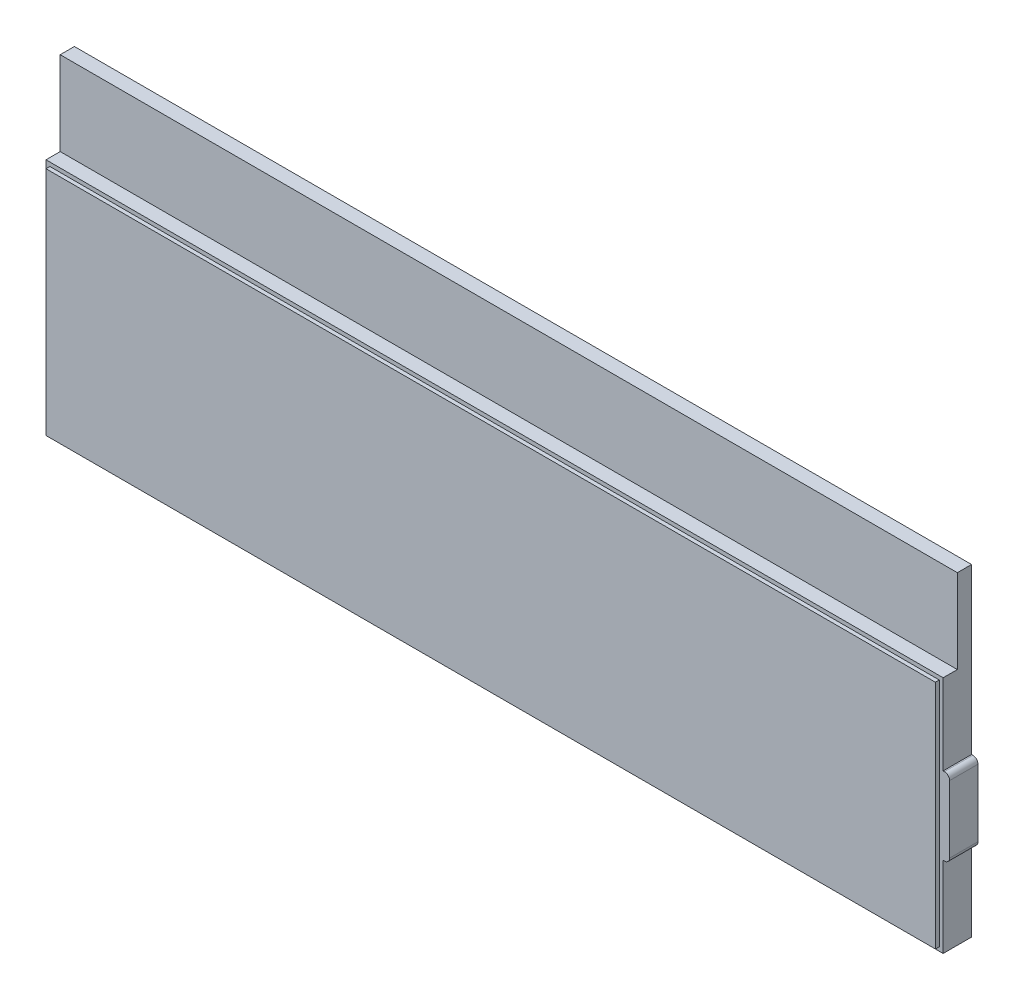
ISO-10303-21;
HEADER;
FILE_DESCRIPTION(('STEP AP214'),'2;1');
FILE_NAME('part.step','',(''),(''),'','','');
FILE_SCHEMA(('AUTOMOTIVE_DESIGN { 1 0 10303 214 1 1 1 1 }'));
ENDSEC;
DATA;
#1=APPLICATION_CONTEXT('core data for automotive mechanical design processes');
#2=APPLICATION_PROTOCOL_DEFINITION('international standard','automotive_design',2000,#1);
#3=PRODUCT_CONTEXT('',#1,'mechanical');
#4=PRODUCT('Part','Part','',(#3));
#5=PRODUCT_RELATED_PRODUCT_CATEGORY('part','',(#4));
#6=PRODUCT_DEFINITION_FORMATION('','',#4);
#7=PRODUCT_DEFINITION_CONTEXT('part definition',#1,'design');
#8=PRODUCT_DEFINITION('design','',#6,#7);
#9=PRODUCT_DEFINITION_SHAPE('','',#8);
#10=(LENGTH_UNIT() NAMED_UNIT(*) SI_UNIT(.MILLI.,.METRE.));
#11=(NAMED_UNIT(*) PLANE_ANGLE_UNIT() SI_UNIT($,.RADIAN.));
#12=(NAMED_UNIT(*) SI_UNIT($,.STERADIAN.) SOLID_ANGLE_UNIT());
#13=UNCERTAINTY_MEASURE_WITH_UNIT(LENGTH_MEASURE(1.E-05),#10,'distance_accuracy_value','');
#14=(GEOMETRIC_REPRESENTATION_CONTEXT(3) GLOBAL_UNCERTAINTY_ASSIGNED_CONTEXT((#13)) GLOBAL_UNIT_ASSIGNED_CONTEXT((#10,
#11,#12)) REPRESENTATION_CONTEXT('',''));
#15=CARTESIAN_POINT('',(0.,0.,0.));
#16=DIRECTION('',(0.,0.,1.));
#17=DIRECTION('',(1.,0.,0.));
#18=AXIS2_PLACEMENT_3D('',#15,#16,#17);
#19=CARTESIAN_POINT('',(0.,0.,2.5));
#20=DIRECTION('',(0.,0.,1.));
#21=DIRECTION('',(1.,0.,0.));
#22=AXIS2_PLACEMENT_3D('',#19,#20,#21);
#23=PLANE('',#22);
#24=DIRECTION('',(0.,1.,0.));
#25=VECTOR('',#24,1.);
#26=CARTESIAN_POINT('',(69.2,0.3,2.5));
#27=LINE('',#26,#25);
#28=CARTESIAN_POINT('',(69.2,18.2,2.5));
#29=VERTEX_POINT('',#28);
#30=CARTESIAN_POINT('',(69.2,0.3,2.5));
#31=VERTEX_POINT('',#30);
#32=EDGE_CURVE('E230',#29,#31,#27,.F.);
#33=ORIENTED_EDGE('',*,*,#32,.F.);
#34=DIRECTION('',(1.,0.,0.));
#35=VECTOR('',#34,1.);
#36=CARTESIAN_POINT('',(69.2,18.2,2.5));
#37=LINE('',#36,#35);
#38=CARTESIAN_POINT('',(0.299999999999999,18.2,2.5));
#39=VERTEX_POINT('',#38);
#40=EDGE_CURVE('E195',#39,#29,#37,.T.);
#41=ORIENTED_EDGE('',*,*,#40,.F.);
#42=DIRECTION('',(0.,1.,0.));
#43=VECTOR('',#42,1.);
#44=CARTESIAN_POINT('',(0.3,18.2,2.5));
#45=LINE('',#44,#43);
#46=CARTESIAN_POINT('',(0.3,0.3,2.5));
#47=VERTEX_POINT('',#46);
#48=EDGE_CURVE('E220',#47,#39,#45,.T.);
#49=ORIENTED_EDGE('',*,*,#48,.F.);
#50=DIRECTION('',(1.,0.,0.));
#51=VECTOR('',#50,1.);
#52=CARTESIAN_POINT('',(0.3,0.3,2.5));
#53=LINE('',#52,#51);
#54=EDGE_CURVE('E225',#31,#47,#53,.F.);
#55=ORIENTED_EDGE('',*,*,#54,.F.);
#56=EDGE_LOOP('',(#33,#41,#49,#55));
#57=FACE_BOUND('',#56,.T.);
#58=ADVANCED_FACE('F17',(#57),#23,.T.);
#59=CARTESIAN_POINT('',(69.2,0.3,2.2));
#60=DIRECTION('',(1.,0.,0.));
#61=DIRECTION('',(0.,0.,-1.));
#62=AXIS2_PLACEMENT_3D('',#59,#60,#61);
#63=PLANE('',#62);
#64=DIRECTION('',(0.,0.,1.));
#65=VECTOR('',#64,1.);
#66=CARTESIAN_POINT('',(69.2,18.2,2.2));
#67=LINE('',#66,#65);
#68=CARTESIAN_POINT('',(69.2,18.2,2.2));
#69=VERTEX_POINT('',#68);
#70=EDGE_CURVE('E217',#29,#69,#67,.F.);
#71=ORIENTED_EDGE('',*,*,#70,.F.);
#72=ORIENTED_EDGE('',*,*,#32,.T.);
#73=DIRECTION('',(0.,0.,-1.));
#74=VECTOR('',#73,1.);
#75=CARTESIAN_POINT('',(69.2,0.3,2.2));
#76=LINE('',#75,#74);
#77=CARTESIAN_POINT('',(69.2,0.3,2.2));
#78=VERTEX_POINT('',#77);
#79=EDGE_CURVE('E227',#78,#31,#76,.F.);
#80=ORIENTED_EDGE('',*,*,#79,.F.);
#81=DIRECTION('',(0.,1.,0.));
#82=VECTOR('',#81,1.);
#83=CARTESIAN_POINT('',(69.2,0.,2.2));
#84=LINE('',#83,#82);
#85=EDGE_CURVE('E296',#69,#78,#84,.F.);
#86=ORIENTED_EDGE('',*,*,#85,.F.);
#87=EDGE_LOOP('',(#71,#72,#80,#86));
#88=FACE_BOUND('',#87,.T.);
#89=ADVANCED_FACE('F554',(#88),#63,.T.);
#90=CARTESIAN_POINT('',(0.3,0.3,2.2));
#91=DIRECTION('',(0.,-1.,0.));
#92=DIRECTION('',(0.,0.,-1.));
#93=AXIS2_PLACEMENT_3D('',#90,#91,#92);
#94=PLANE('',#93);
#95=ORIENTED_EDGE('',*,*,#79,.T.);
#96=ORIENTED_EDGE('',*,*,#54,.T.);
#97=DIRECTION('',(0.,0.,1.));
#98=VECTOR('',#97,1.);
#99=CARTESIAN_POINT('',(0.3,0.300000000000002,2.2));
#100=LINE('',#99,#98);
#101=CARTESIAN_POINT('',(0.3,0.3,2.2));
#102=VERTEX_POINT('',#101);
#103=EDGE_CURVE('E222',#102,#47,#100,.T.);
#104=ORIENTED_EDGE('',*,*,#103,.F.);
#105=DIRECTION('',(1.,0.,0.));
#106=VECTOR('',#105,1.);
#107=CARTESIAN_POINT('',(0.,0.3,2.2));
#108=LINE('',#107,#106);
#109=EDGE_CURVE('E293',#78,#102,#108,.F.);
#110=ORIENTED_EDGE('',*,*,#109,.F.);
#111=EDGE_LOOP('',(#95,#96,#104,#110));
#112=FACE_BOUND('',#111,.T.);
#113=ADVANCED_FACE('F545',(#112),#94,.T.);
#114=CARTESIAN_POINT('',(0.3,18.2,2.2));
#115=DIRECTION('',(-1.,0.,0.));
#116=DIRECTION('',(0.,0.,1.));
#117=AXIS2_PLACEMENT_3D('',#114,#115,#116);
#118=PLANE('',#117);
#119=ORIENTED_EDGE('',*,*,#103,.T.);
#120=ORIENTED_EDGE('',*,*,#48,.T.);
#121=DIRECTION('',(0.,0.,1.));
#122=VECTOR('',#121,1.);
#123=CARTESIAN_POINT('',(0.299999999999995,18.2,2.2));
#124=LINE('',#123,#122);
#125=CARTESIAN_POINT('',(0.299999999999999,18.2,2.2));
#126=VERTEX_POINT('',#125);
#127=EDGE_CURVE('E214',#126,#39,#124,.T.);
#128=ORIENTED_EDGE('',*,*,#127,.F.);
#129=DIRECTION('',(0.,1.,0.));
#130=VECTOR('',#129,1.);
#131=CARTESIAN_POINT('',(0.3,0.,2.2));
#132=LINE('',#131,#130);
#133=EDGE_CURVE('E290',#102,#126,#132,.T.);
#134=ORIENTED_EDGE('',*,*,#133,.F.);
#135=EDGE_LOOP('',(#119,#120,#128,#134));
#136=FACE_BOUND('',#135,.T.);
#137=ADVANCED_FACE('F536',(#136),#118,.T.);
#138=CARTESIAN_POINT('',(69.2,18.2,2.2));
#139=DIRECTION('',(0.,1.,0.));
#140=DIRECTION('',(0.,0.,1.));
#141=AXIS2_PLACEMENT_3D('',#138,#139,#140);
#142=PLANE('',#141);
#143=ORIENTED_EDGE('',*,*,#127,.T.);
#144=ORIENTED_EDGE('',*,*,#40,.T.);
#145=ORIENTED_EDGE('',*,*,#70,.T.);
#146=DIRECTION('',(1.,0.,0.));
#147=VECTOR('',#146,1.);
#148=CARTESIAN_POINT('',(0.,18.2,2.2));
#149=LINE('',#148,#147);
#150=EDGE_CURVE('E265',#126,#69,#149,.T.);
#151=ORIENTED_EDGE('',*,*,#150,.F.);
#152=EDGE_LOOP('',(#143,#144,#145,#151));
#153=FACE_BOUND('',#152,.T.);
#154=ADVANCED_FACE('F528',(#153),#142,.T.);
#155=CARTESIAN_POINT('',(69.5,18.5,1.1));
#156=DIRECTION('',(0.,1.,0.));
#157=DIRECTION('',(0.,0.,1.));
#158=AXIS2_PLACEMENT_3D('',#155,#156,#157);
#159=PLANE('',#158);
#160=DIRECTION('',(0.,0.,1.));
#161=VECTOR('',#160,1.);
#162=CARTESIAN_POINT('',(0.,18.5,1.1));
#163=LINE('',#162,#161);
#164=CARTESIAN_POINT('',(0.,18.5,1.1));
#165=VERTEX_POINT('',#164);
#166=CARTESIAN_POINT('',(0.,18.5,2.2));
#167=VERTEX_POINT('',#166);
#168=EDGE_CURVE('E161',#165,#167,#163,.T.);
#169=ORIENTED_EDGE('',*,*,#168,.T.);
#170=DIRECTION('',(1.,0.,0.));
#171=VECTOR('',#170,1.);
#172=CARTESIAN_POINT('',(0.,18.5,2.2));
#173=LINE('',#172,#171);
#174=CARTESIAN_POINT('',(69.5,18.5,2.2));
#175=VERTEX_POINT('',#174);
#176=EDGE_CURVE('E264',#175,#167,#173,.F.);
#177=ORIENTED_EDGE('',*,*,#176,.F.);
#178=DIRECTION('',(0.,0.,1.));
#179=VECTOR('',#178,1.);
#180=CARTESIAN_POINT('',(69.5,18.5,1.1));
#181=LINE('',#180,#179);
#182=CARTESIAN_POINT('',(69.5,18.5,1.1));
#183=VERTEX_POINT('',#182);
#184=EDGE_CURVE('E193',#175,#183,#181,.F.);
#185=ORIENTED_EDGE('',*,*,#184,.T.);
#186=DIRECTION('',(1.,0.,0.));
#187=VECTOR('',#186,1.);
#188=CARTESIAN_POINT('',(0.,18.5,1.1));
#189=LINE('',#188,#187);
#190=EDGE_CURVE('E199',#165,#183,#189,.T.);
#191=ORIENTED_EDGE('',*,*,#190,.F.);
#192=EDGE_LOOP('',(#169,#177,#185,#191));
#193=FACE_BOUND('',#192,.T.);
#194=ADVANCED_FACE('F520',(#193),#159,.T.);
#195=CARTESIAN_POINT('',(69.6,6.25,0.));
#196=DIRECTION('',(0.,-1.,0.));
#197=DIRECTION('',(0.,0.,-1.));
#198=AXIS2_PLACEMENT_3D('',#195,#196,#197);
#199=PLANE('',#198);
#200=DIRECTION('',(1.,0.,0.));
#201=VECTOR('',#200,1.);
#202=CARTESIAN_POINT('',(69.6,6.25,0.));
#203=LINE('',#202,#201);
#204=CARTESIAN_POINT('',(69.5,6.25,0.));
#205=VERTEX_POINT('',#204);
#206=CARTESIAN_POINT('',(69.6,6.25,0.));
#207=VERTEX_POINT('',#206);
#208=EDGE_CURVE('E150',#205,#207,#203,.T.);
#209=ORIENTED_EDGE('',*,*,#208,.T.);
#210=DIRECTION('',(0.,0.,-1.));
#211=VECTOR('',#210,1.);
#212=CARTESIAN_POINT('',(69.6,6.25,0.));
#213=LINE('',#212,#211);
#214=CARTESIAN_POINT('',(69.6,6.25,2.2));
#215=VERTEX_POINT('',#214);
#216=EDGE_CURVE('E154',#215,#207,#213,.T.);
#217=ORIENTED_EDGE('',*,*,#216,.F.);
#218=DIRECTION('',(1.,0.,0.));
#219=VECTOR('',#218,1.);
#220=CARTESIAN_POINT('',(0.,6.25,2.2));
#221=LINE('',#220,#219);
#222=CARTESIAN_POINT('',(69.5,6.25,2.2));
#223=VERTEX_POINT('',#222);
#224=EDGE_CURVE('E250',#223,#215,#221,.T.);
#225=ORIENTED_EDGE('',*,*,#224,.F.);
#226=DIRECTION('',(0.,0.,-1.));
#227=VECTOR('',#226,1.);
#228=CARTESIAN_POINT('',(69.5,6.25,0.));
#229=LINE('',#228,#227);
#230=EDGE_CURVE('E157',#205,#223,#229,.F.);
#231=ORIENTED_EDGE('',*,*,#230,.F.);
#232=EDGE_LOOP('',(#209,#217,#225,#231));
#233=FACE_BOUND('',#232,.T.);
#234=ADVANCED_FACE('F152',(#233),#199,.T.);
#235=CARTESIAN_POINT('',(69.6,6.65,0.));
#236=DIRECTION('',(0.,0.,-1.));
#237=DIRECTION('',(-1.,0.,0.));
#238=AXIS2_PLACEMENT_3D('',#235,#236,#237);
#239=CYLINDRICAL_SURFACE('',#238,0.4);
#240=DIRECTION('',(0.,0.,-1.));
#241=VECTOR('',#240,1.);
#242=CARTESIAN_POINT('',(70.,6.65,0.));
#243=LINE('',#242,#241);
#244=CARTESIAN_POINT('',(70.,6.65,2.2));
#245=VERTEX_POINT('',#244);
#246=CARTESIAN_POINT('',(70.,6.65,0.));
#247=VERTEX_POINT('',#246);
#248=EDGE_CURVE('E273',#245,#247,#243,.T.);
#249=ORIENTED_EDGE('',*,*,#248,.F.);
#250=CARTESIAN_POINT('',(69.6,6.65,2.2));
#251=DIRECTION('',(0.,0.,-1.));
#252=DIRECTION('',(-1.,0.,0.));
#253=AXIS2_PLACEMENT_3D('',#250,#251,#252);
#254=CIRCLE('',#253,0.4);
#255=EDGE_CURVE('E175',#215,#245,#254,.F.);
#256=ORIENTED_EDGE('',*,*,#255,.F.);
#257=ORIENTED_EDGE('',*,*,#216,.T.);
#258=CARTESIAN_POINT('',(69.6,6.65,0.));
#259=DIRECTION('',(0.,0.,-1.));
#260=DIRECTION('',(-1.,0.,0.));
#261=AXIS2_PLACEMENT_3D('',#258,#259,#260);
#262=CIRCLE('',#261,0.4);
#263=EDGE_CURVE('E20',#207,#247,#262,.F.);
#264=ORIENTED_EDGE('',*,*,#263,.T.);
#265=EDGE_LOOP('',(#249,#256,#257,#264));
#266=FACE_BOUND('',#265,.T.);
#267=ADVANCED_FACE('F173',(#266),#239,.T.);
#268=CARTESIAN_POINT('',(69.6,11.85,0.));
#269=DIRECTION('',(0.,0.,-1.));
#270=DIRECTION('',(-1.,0.,0.));
#271=AXIS2_PLACEMENT_3D('',#268,#269,#270);
#272=CYLINDRICAL_SURFACE('',#271,0.4);
#273=DIRECTION('',(0.,0.,1.));
#274=VECTOR('',#273,1.);
#275=CARTESIAN_POINT('',(69.6,12.25,0.));
#276=LINE('',#275,#274);
#277=CARTESIAN_POINT('',(69.6,12.25,2.2));
#278=VERTEX_POINT('',#277);
#279=CARTESIAN_POINT('',(69.6,12.25,0.));
#280=VERTEX_POINT('',#279);
#281=EDGE_CURVE('E196',#278,#280,#276,.F.);
#282=ORIENTED_EDGE('',*,*,#281,.F.);
#283=CARTESIAN_POINT('',(69.6,11.85,2.2));
#284=DIRECTION('',(0.,0.,-1.));
#285=DIRECTION('',(-1.,0.,0.));
#286=AXIS2_PLACEMENT_3D('',#283,#284,#285);
#287=CIRCLE('',#286,0.4);
#288=CARTESIAN_POINT('',(70.,11.85,2.2));
#289=VERTEX_POINT('',#288);
#290=EDGE_CURVE('E247',#289,#278,#287,.F.);
#291=ORIENTED_EDGE('',*,*,#290,.F.);
#292=DIRECTION('',(0.,0.,-1.));
#293=VECTOR('',#292,1.);
#294=CARTESIAN_POINT('',(70.,11.85,0.));
#295=LINE('',#294,#293);
#296=CARTESIAN_POINT('',(70.,11.85,0.));
#297=VERTEX_POINT('',#296);
#298=EDGE_CURVE('E257',#297,#289,#295,.F.);
#299=ORIENTED_EDGE('',*,*,#298,.F.);
#300=CARTESIAN_POINT('',(69.6,11.85,0.));
#301=DIRECTION('',(0.,0.,-1.));
#302=DIRECTION('',(-1.,0.,0.));
#303=AXIS2_PLACEMENT_3D('',#300,#301,#302);
#304=CIRCLE('',#303,0.4);
#305=EDGE_CURVE('E172',#297,#280,#304,.F.);
#306=ORIENTED_EDGE('',*,*,#305,.T.);
#307=EDGE_LOOP('',(#282,#291,#299,#306));
#308=FACE_BOUND('',#307,.T.);
#309=ADVANCED_FACE('F254',(#308),#272,.T.);
#310=CARTESIAN_POINT('',(69.5,12.25,0.));
#311=DIRECTION('',(0.,1.,0.));
#312=DIRECTION('',(0.,0.,1.));
#313=AXIS2_PLACEMENT_3D('',#310,#311,#312);
#314=PLANE('',#313);
#315=DIRECTION('',(1.,0.,0.));
#316=VECTOR('',#315,1.);
#317=CARTESIAN_POINT('',(0.,12.25,2.2));
#318=LINE('',#317,#316);
#319=CARTESIAN_POINT('',(69.5,12.25,2.2));
#320=VERTEX_POINT('',#319);
#321=EDGE_CURVE('E261',#278,#320,#318,.F.);
#322=ORIENTED_EDGE('',*,*,#321,.F.);
#323=ORIENTED_EDGE('',*,*,#281,.T.);
#324=DIRECTION('',(1.,0.,0.));
#325=VECTOR('',#324,1.);
#326=CARTESIAN_POINT('',(69.5,12.25,0.));
#327=LINE('',#326,#325);
#328=CARTESIAN_POINT('',(69.5,12.25,0.));
#329=VERTEX_POINT('',#328);
#330=EDGE_CURVE('E200',#280,#329,#327,.F.);
#331=ORIENTED_EDGE('',*,*,#330,.T.);
#332=DIRECTION('',(0.,0.,-1.));
#333=VECTOR('',#332,1.);
#334=CARTESIAN_POINT('',(69.5,12.25,0.));
#335=LINE('',#334,#333);
#336=EDGE_CURVE('E201',#320,#329,#335,.T.);
#337=ORIENTED_EDGE('',*,*,#336,.F.);
#338=EDGE_LOOP('',(#322,#323,#331,#337));
#339=FACE_BOUND('',#338,.T.);
#340=ADVANCED_FACE('F259',(#339),#314,.T.);
#341=CARTESIAN_POINT('',(0.,0.,1.1));
#342=DIRECTION('',(0.,0.,1.));
#343=DIRECTION('',(1.,0.,0.));
#344=AXIS2_PLACEMENT_3D('',#341,#342,#343);
#345=PLANE('',#344);
#346=DIRECTION('',(0.,1.,0.));
#347=VECTOR('',#346,1.);
#348=CARTESIAN_POINT('',(69.5,0.,1.1));
#349=LINE('',#348,#347);
#350=CARTESIAN_POINT('',(69.5,25.,1.1));
#351=VERTEX_POINT('',#350);
#352=EDGE_CURVE('E204',#351,#183,#349,.F.);
#353=ORIENTED_EDGE('',*,*,#352,.F.);
#354=DIRECTION('',(1.,0.,0.));
#355=VECTOR('',#354,1.);
#356=CARTESIAN_POINT('',(69.5,25.,1.1));
#357=LINE('',#356,#355);
#358=CARTESIAN_POINT('',(0.,25.,1.1));
#359=VERTEX_POINT('',#358);
#360=EDGE_CURVE('E314',#359,#351,#357,.T.);
#361=ORIENTED_EDGE('',*,*,#360,.F.);
#362=DIRECTION('',(0.,1.,0.));
#363=VECTOR('',#362,1.);
#364=CARTESIAN_POINT('',(0.,25.,1.1));
#365=LINE('',#364,#363);
#366=EDGE_CURVE('E306',#165,#359,#365,.T.);
#367=ORIENTED_EDGE('',*,*,#366,.F.);
#368=ORIENTED_EDGE('',*,*,#190,.T.);
#369=EDGE_LOOP('',(#353,#361,#367,#368));
#370=FACE_BOUND('',#369,.T.);
#371=ADVANCED_FACE('F303',(#370),#345,.T.);
#372=CARTESIAN_POINT('',(0.,0.,2.2));
#373=DIRECTION('',(0.,0.,1.));
#374=DIRECTION('',(1.,0.,0.));
#375=AXIS2_PLACEMENT_3D('',#372,#373,#374);
#376=PLANE('',#375);
#377=DIRECTION('',(0.,1.,0.));
#378=VECTOR('',#377,1.);
#379=CARTESIAN_POINT('',(70.,11.85,2.2));
#380=LINE('',#379,#378);
#381=EDGE_CURVE('E180',#289,#245,#380,.F.);
#382=ORIENTED_EDGE('',*,*,#381,.F.);
#383=ORIENTED_EDGE('',*,*,#290,.T.);
#384=ORIENTED_EDGE('',*,*,#321,.T.);
#385=DIRECTION('',(0.,1.,0.));
#386=VECTOR('',#385,1.);
#387=CARTESIAN_POINT('',(69.5,0.,2.2));
#388=LINE('',#387,#386);
#389=EDGE_CURVE('E205',#175,#320,#388,.F.);
#390=ORIENTED_EDGE('',*,*,#389,.F.);
#391=ORIENTED_EDGE('',*,*,#176,.T.);
#392=DIRECTION('',(0.,1.,0.));
#393=VECTOR('',#392,1.);
#394=CARTESIAN_POINT('',(0.,25.,2.2));
#395=LINE('',#394,#393);
#396=CARTESIAN_POINT('',(0.,0.,2.2));
#397=VERTEX_POINT('',#396);
#398=EDGE_CURVE('E325',#397,#167,#395,.T.);
#399=ORIENTED_EDGE('',*,*,#398,.F.);
#400=DIRECTION('',(1.,0.,0.));
#401=VECTOR('',#400,1.);
#402=CARTESIAN_POINT('',(0.,0.,2.2));
#403=LINE('',#402,#401);
#404=CARTESIAN_POINT('',(69.5,0.,2.2));
#405=VERTEX_POINT('',#404);
#406=EDGE_CURVE('E189',#405,#397,#403,.F.);
#407=ORIENTED_EDGE('',*,*,#406,.F.);
#408=DIRECTION('',(0.,1.,0.));
#409=VECTOR('',#408,1.);
#410=CARTESIAN_POINT('',(69.5,0.,2.2));
#411=LINE('',#410,#409);
#412=EDGE_CURVE('E182',#223,#405,#411,.F.);
#413=ORIENTED_EDGE('',*,*,#412,.F.);
#414=ORIENTED_EDGE('',*,*,#224,.T.);
#415=ORIENTED_EDGE('',*,*,#255,.T.);
#416=EDGE_LOOP('',(#382,#383,#384,#390,#391,#399,#407,#413,#414,#415));
#417=FACE_BOUND('',#416,.T.);
#418=ORIENTED_EDGE('',*,*,#133,.T.);
#419=ORIENTED_EDGE('',*,*,#150,.T.);
#420=ORIENTED_EDGE('',*,*,#85,.T.);
#421=ORIENTED_EDGE('',*,*,#109,.T.);
#422=EDGE_LOOP('',(#418,#419,#420,#421));
#423=FACE_BOUND('',#422,.T.);
#424=ADVANCED_FACE('F268',(#417,#423),#376,.T.);
#425=CARTESIAN_POINT('',(0.,0.,0.));
#426=DIRECTION('',(0.,-1.,0.));
#427=DIRECTION('',(0.,0.,-1.));
#428=AXIS2_PLACEMENT_3D('',#425,#426,#427);
#429=PLANE('',#428);
#430=DIRECTION('',(1.,0.,0.));
#431=VECTOR('',#430,1.);
#432=CARTESIAN_POINT('',(0.,0.,0.));
#433=LINE('',#432,#431);
#434=CARTESIAN_POINT('',(0.,0.,0.));
#435=VERTEX_POINT('',#434);
#436=CARTESIAN_POINT('',(69.5,0.,0.));
#437=VERTEX_POINT('',#436);
#438=EDGE_CURVE('E244',#435,#437,#433,.T.);
#439=ORIENTED_EDGE('',*,*,#438,.T.);
#440=DIRECTION('',(0.,0.,-1.));
#441=VECTOR('',#440,1.);
#442=CARTESIAN_POINT('',(69.5,0.,0.));
#443=LINE('',#442,#441);
#444=EDGE_CURVE('E185',#405,#437,#443,.T.);
#445=ORIENTED_EDGE('',*,*,#444,.F.);
#446=ORIENTED_EDGE('',*,*,#406,.T.);
#447=DIRECTION('',(0.,0.,1.));
#448=VECTOR('',#447,1.);
#449=CARTESIAN_POINT('',(0.,0.,0.));
#450=LINE('',#449,#448);
#451=EDGE_CURVE('E322',#435,#397,#450,.T.);
#452=ORIENTED_EDGE('',*,*,#451,.F.);
#453=EDGE_LOOP('',(#439,#445,#446,#452));
#454=FACE_BOUND('',#453,.T.);
#455=ADVANCED_FACE('F468',(#454),#429,.T.);
#456=CARTESIAN_POINT('',(69.5,0.,0.));
#457=DIRECTION('',(1.,0.,0.));
#458=DIRECTION('',(0.,0.,-1.));
#459=AXIS2_PLACEMENT_3D('',#456,#457,#458);
#460=PLANE('',#459);
#461=ORIENTED_EDGE('',*,*,#412,.T.);
#462=ORIENTED_EDGE('',*,*,#444,.T.);
#463=DIRECTION('',(0.,1.,0.));
#464=VECTOR('',#463,1.);
#465=CARTESIAN_POINT('',(69.5,0.,0.));
#466=LINE('',#465,#464);
#467=EDGE_CURVE('E242',#437,#205,#466,.T.);
#468=ORIENTED_EDGE('',*,*,#467,.T.);
#469=ORIENTED_EDGE('',*,*,#230,.T.);
#470=EDGE_LOOP('',(#461,#462,#468,#469));
#471=FACE_BOUND('',#470,.T.);
#472=ADVANCED_FACE('F460',(#471),#460,.T.);
#473=CARTESIAN_POINT('',(70.,11.85,0.));
#474=DIRECTION('',(1.,0.,0.));
#475=DIRECTION('',(0.,0.,-1.));
#476=AXIS2_PLACEMENT_3D('',#473,#474,#475);
#477=PLANE('',#476);
#478=ORIENTED_EDGE('',*,*,#298,.T.);
#479=ORIENTED_EDGE('',*,*,#381,.T.);
#480=ORIENTED_EDGE('',*,*,#248,.T.);
#481=DIRECTION('',(0.,1.,0.));
#482=VECTOR('',#481,1.);
#483=CARTESIAN_POINT('',(70.,0.,0.));
#484=LINE('',#483,#482);
#485=EDGE_CURVE('E169',#247,#297,#484,.T.);
#486=ORIENTED_EDGE('',*,*,#485,.T.);
#487=EDGE_LOOP('',(#478,#479,#480,#486));
#488=FACE_BOUND('',#487,.T.);
#489=ADVANCED_FACE('F272',(#488),#477,.T.);
#490=CARTESIAN_POINT('',(69.5,0.,0.));
#491=DIRECTION('',(1.,0.,0.));
#492=DIRECTION('',(0.,0.,-1.));
#493=AXIS2_PLACEMENT_3D('',#490,#491,#492);
#494=PLANE('',#493);
#495=ORIENTED_EDGE('',*,*,#352,.T.);
#496=ORIENTED_EDGE('',*,*,#184,.F.);
#497=ORIENTED_EDGE('',*,*,#389,.T.);
#498=ORIENTED_EDGE('',*,*,#336,.T.);
#499=DIRECTION('',(0.,1.,0.));
#500=VECTOR('',#499,1.);
#501=CARTESIAN_POINT('',(69.5,0.,0.));
#502=LINE('',#501,#500);
#503=CARTESIAN_POINT('',(69.5,25.,0.));
#504=VERTEX_POINT('',#503);
#505=EDGE_CURVE('E235',#329,#504,#502,.T.);
#506=ORIENTED_EDGE('',*,*,#505,.T.);
#507=DIRECTION('',(0.,0.,1.));
#508=VECTOR('',#507,1.);
#509=CARTESIAN_POINT('',(69.5,25.,0.));
#510=LINE('',#509,#508);
#511=EDGE_CURVE('E312',#351,#504,#510,.F.);
#512=ORIENTED_EDGE('',*,*,#511,.F.);
#513=EDGE_LOOP('',(#495,#496,#497,#498,#506,#512));
#514=FACE_BOUND('',#513,.T.);
#515=ADVANCED_FACE('F309',(#514),#494,.T.);
#516=CARTESIAN_POINT('',(69.5,25.,0.));
#517=DIRECTION('',(0.,1.,0.));
#518=DIRECTION('',(0.,0.,1.));
#519=AXIS2_PLACEMENT_3D('',#516,#517,#518);
#520=PLANE('',#519);
#521=DIRECTION('',(0.,0.,1.));
#522=VECTOR('',#521,1.);
#523=CARTESIAN_POINT('',(0.,25.,0.));
#524=LINE('',#523,#522);
#525=CARTESIAN_POINT('',(0.,25.,0.));
#526=VERTEX_POINT('',#525);
#527=EDGE_CURVE('E319',#359,#526,#524,.F.);
#528=ORIENTED_EDGE('',*,*,#527,.F.);
#529=ORIENTED_EDGE('',*,*,#360,.T.);
#530=ORIENTED_EDGE('',*,*,#511,.T.);
#531=DIRECTION('',(1.,0.,0.));
#532=VECTOR('',#531,1.);
#533=CARTESIAN_POINT('',(0.,25.,0.));
#534=LINE('',#533,#532);
#535=EDGE_CURVE('E237',#504,#526,#534,.F.);
#536=ORIENTED_EDGE('',*,*,#535,.T.);
#537=EDGE_LOOP('',(#528,#529,#530,#536));
#538=FACE_BOUND('',#537,.T.);
#539=ADVANCED_FACE('F436',(#538),#520,.T.);
#540=CARTESIAN_POINT('',(0.,25.,0.));
#541=DIRECTION('',(-1.,0.,0.));
#542=DIRECTION('',(0.,0.,1.));
#543=AXIS2_PLACEMENT_3D('',#540,#541,#542);
#544=PLANE('',#543);
#545=ORIENTED_EDGE('',*,*,#451,.T.);
#546=ORIENTED_EDGE('',*,*,#398,.T.);
#547=ORIENTED_EDGE('',*,*,#168,.F.);
#548=ORIENTED_EDGE('',*,*,#366,.T.);
#549=ORIENTED_EDGE('',*,*,#527,.T.);
#550=DIRECTION('',(0.,1.,0.));
#551=VECTOR('',#550,1.);
#552=CARTESIAN_POINT('',(0.,0.,0.));
#553=LINE('',#552,#551);
#554=EDGE_CURVE('E331',#526,#435,#553,.F.);
#555=ORIENTED_EDGE('',*,*,#554,.T.);
#556=EDGE_LOOP('',(#545,#546,#547,#548,#549,#555));
#557=FACE_BOUND('',#556,.T.);
#558=ADVANCED_FACE('F382',(#557),#544,.T.);
#559=CARTESIAN_POINT('',(0.,0.,0.));
#560=DIRECTION('',(0.,0.,1.));
#561=DIRECTION('',(1.,0.,0.));
#562=AXIS2_PLACEMENT_3D('',#559,#560,#561);
#563=PLANE('',#562);
#564=ORIENTED_EDGE('',*,*,#535,.F.);
#565=ORIENTED_EDGE('',*,*,#505,.F.);
#566=ORIENTED_EDGE('',*,*,#330,.F.);
#567=ORIENTED_EDGE('',*,*,#305,.F.);
#568=ORIENTED_EDGE('',*,*,#485,.F.);
#569=ORIENTED_EDGE('',*,*,#263,.F.);
#570=ORIENTED_EDGE('',*,*,#208,.F.);
#571=ORIENTED_EDGE('',*,*,#467,.F.);
#572=ORIENTED_EDGE('',*,*,#438,.F.);
#573=ORIENTED_EDGE('',*,*,#554,.F.);
#574=EDGE_LOOP('',(#564,#565,#566,#567,#568,#569,#570,#571,#572,#573));
#575=FACE_BOUND('',#574,.T.);
#576=DIRECTION('',(1.,0.,0.));
#577=VECTOR('',#576,1.);
#578=CARTESIAN_POINT('',(0.3,18.2,0.));
#579=LINE('',#578,#577);
#580=CARTESIAN_POINT('',(0.3,18.2,0.));
#581=VERTEX_POINT('',#580);
#582=CARTESIAN_POINT('',(69.2,18.2,0.));
#583=VERTEX_POINT('',#582);
#584=EDGE_CURVE('E344',#581,#583,#579,.T.);
#585=ORIENTED_EDGE('',*,*,#584,.F.);
#586=DIRECTION('',(0.,1.,0.));
#587=VECTOR('',#586,1.);
#588=CARTESIAN_POINT('',(0.3,0.3,0.));
#589=LINE('',#588,#587);
#590=CARTESIAN_POINT('',(0.299999999999997,0.3,0.));
#591=VERTEX_POINT('',#590);
#592=EDGE_CURVE('E339',#591,#581,#589,.T.);
#593=ORIENTED_EDGE('',*,*,#592,.F.);
#594=DIRECTION('',(1.,0.,0.));
#595=VECTOR('',#594,1.);
#596=CARTESIAN_POINT('',(69.2,0.3,0.));
#597=LINE('',#596,#595);
#598=CARTESIAN_POINT('',(69.2,0.3,0.));
#599=VERTEX_POINT('',#598);
#600=EDGE_CURVE('E334',#599,#591,#597,.F.);
#601=ORIENTED_EDGE('',*,*,#600,.F.);
#602=DIRECTION('',(0.,1.,0.));
#603=VECTOR('',#602,1.);
#604=CARTESIAN_POINT('',(69.2,18.2,0.));
#605=LINE('',#604,#603);
#606=EDGE_CURVE('E347',#583,#599,#605,.F.);
#607=ORIENTED_EDGE('',*,*,#606,.F.);
#608=EDGE_LOOP('',(#585,#593,#601,#607));
#609=FACE_BOUND('',#608,.T.);
#610=ADVANCED_FACE('F166',(#575,#609),#563,.F.);
#611=CARTESIAN_POINT('',(69.2,0.3,0.));
#612=DIRECTION('',(0.,-1.,0.));
#613=DIRECTION('',(0.,0.,-1.));
#614=AXIS2_PLACEMENT_3D('',#611,#612,#613);
#615=PLANE('',#614);
#616=DIRECTION('',(0.,0.,1.));
#617=VECTOR('',#616,1.);
#618=CARTESIAN_POINT('',(0.3,0.3,0.));
#619=LINE('',#618,#617);
#620=CARTESIAN_POINT('',(0.299999999999997,0.3,-0.3));
#621=VERTEX_POINT('',#620);
#622=EDGE_CURVE('E336',#621,#591,#619,.T.);
#623=ORIENTED_EDGE('',*,*,#622,.F.);
#624=DIRECTION('',(-1.,0.,0.));
#625=VECTOR('',#624,1.);
#626=CARTESIAN_POINT('',(0.,0.3,-0.3));
#627=LINE('',#626,#625);
#628=CARTESIAN_POINT('',(69.2,0.3,-0.3));
#629=VERTEX_POINT('',#628);
#630=EDGE_CURVE('E353',#629,#621,#627,.T.);
#631=ORIENTED_EDGE('',*,*,#630,.F.);
#632=DIRECTION('',(0.,0.,-1.));
#633=VECTOR('',#632,1.);
#634=CARTESIAN_POINT('',(69.2,0.300000000000002,0.));
#635=LINE('',#634,#633);
#636=EDGE_CURVE('E350',#599,#629,#635,.T.);
#637=ORIENTED_EDGE('',*,*,#636,.F.);
#638=ORIENTED_EDGE('',*,*,#600,.T.);
#639=EDGE_LOOP('',(#623,#631,#637,#638));
#640=FACE_BOUND('',#639,.T.);
#641=ADVANCED_FACE('F373',(#640),#615,.T.);
#642=CARTESIAN_POINT('',(0.3,0.3,0.));
#643=DIRECTION('',(-1.,0.,0.));
#644=DIRECTION('',(0.,0.,1.));
#645=AXIS2_PLACEMENT_3D('',#642,#643,#644);
#646=PLANE('',#645);
#647=DIRECTION('',(0.,0.,1.));
#648=VECTOR('',#647,1.);
#649=CARTESIAN_POINT('',(0.3,18.2,0.));
#650=LINE('',#649,#648);
#651=CARTESIAN_POINT('',(0.3,18.2,-0.3));
#652=VERTEX_POINT('',#651);
#653=EDGE_CURVE('E341',#652,#581,#650,.T.);
#654=ORIENTED_EDGE('',*,*,#653,.F.);
#655=DIRECTION('',(0.,1.,0.));
#656=VECTOR('',#655,1.);
#657=CARTESIAN_POINT('',(0.3,0.,-0.3));
#658=LINE('',#657,#656);
#659=EDGE_CURVE('E356',#621,#652,#658,.T.);
#660=ORIENTED_EDGE('',*,*,#659,.F.);
#661=ORIENTED_EDGE('',*,*,#622,.T.);
#662=ORIENTED_EDGE('',*,*,#592,.T.);
#663=EDGE_LOOP('',(#654,#660,#661,#662));
#664=FACE_BOUND('',#663,.T.);
#665=ADVANCED_FACE('F367',(#664),#646,.T.);
#666=CARTESIAN_POINT('',(0.3,18.2,0.));
#667=DIRECTION('',(0.,1.,0.));
#668=DIRECTION('',(0.,0.,1.));
#669=AXIS2_PLACEMENT_3D('',#666,#667,#668);
#670=PLANE('',#669);
#671=DIRECTION('',(0.,0.,-1.));
#672=VECTOR('',#671,1.);
#673=CARTESIAN_POINT('',(69.2,18.2,0.));
#674=LINE('',#673,#672);
#675=CARTESIAN_POINT('',(69.2,18.2,-0.3));
#676=VERTEX_POINT('',#675);
#677=EDGE_CURVE('E35',#676,#583,#674,.F.);
#678=ORIENTED_EDGE('',*,*,#677,.F.);
#679=DIRECTION('',(-1.,0.,0.));
#680=VECTOR('',#679,1.);
#681=CARTESIAN_POINT('',(0.,18.2,-0.3));
#682=LINE('',#681,#680);
#683=EDGE_CURVE('E26',#652,#676,#682,.F.);
#684=ORIENTED_EDGE('',*,*,#683,.F.);
#685=ORIENTED_EDGE('',*,*,#653,.T.);
#686=ORIENTED_EDGE('',*,*,#584,.T.);
#687=EDGE_LOOP('',(#678,#684,#685,#686));
#688=FACE_BOUND('',#687,.T.);
#689=ADVANCED_FACE('F363',(#688),#670,.T.);
#690=CARTESIAN_POINT('',(69.2,18.2,0.));
#691=DIRECTION('',(1.,0.,0.));
#692=DIRECTION('',(0.,0.,-1.));
#693=AXIS2_PLACEMENT_3D('',#690,#691,#692);
#694=PLANE('',#693);
#695=ORIENTED_EDGE('',*,*,#636,.T.);
#696=DIRECTION('',(0.,1.,0.));
#697=VECTOR('',#696,1.);
#698=CARTESIAN_POINT('',(69.2,0.,-0.3));
#699=LINE('',#698,#697);
#700=EDGE_CURVE('E11',#676,#629,#699,.F.);
#701=ORIENTED_EDGE('',*,*,#700,.F.);
#702=ORIENTED_EDGE('',*,*,#677,.T.);
#703=ORIENTED_EDGE('',*,*,#606,.T.);
#704=EDGE_LOOP('',(#695,#701,#702,#703));
#705=FACE_BOUND('',#704,.T.);
#706=ADVANCED_FACE('F371',(#705),#694,.T.);
#707=CARTESIAN_POINT('',(0.,0.,-0.3));
#708=DIRECTION('',(0.,0.,-1.));
#709=DIRECTION('',(-1.,0.,0.));
#710=AXIS2_PLACEMENT_3D('',#707,#708,#709);
#711=PLANE('',#710);
#712=ORIENTED_EDGE('',*,*,#683,.T.);
#713=ORIENTED_EDGE('',*,*,#700,.T.);
#714=ORIENTED_EDGE('',*,*,#630,.T.);
#715=ORIENTED_EDGE('',*,*,#659,.T.);
#716=EDGE_LOOP('',(#712,#713,#714,#715));
#717=FACE_BOUND('',#716,.T.);
#718=ADVANCED_FACE('F361',(#717),#711,.T.);
#719=CLOSED_SHELL('',(#58,#89,#113,#137,#154,#194,#234,#267,#309,#340,#371,#424,#455,#472,#489,
#515,#539,#558,#610,#641,#665,#689,#706,#718));
#720=MANIFOLD_SOLID_BREP('B1',#719);
#721=ADVANCED_BREP_SHAPE_REPRESENTATION('',(#18,#720),#14);
#722=SHAPE_DEFINITION_REPRESENTATION(#9,#721);
ENDSEC;
END-ISO-10303-21;
